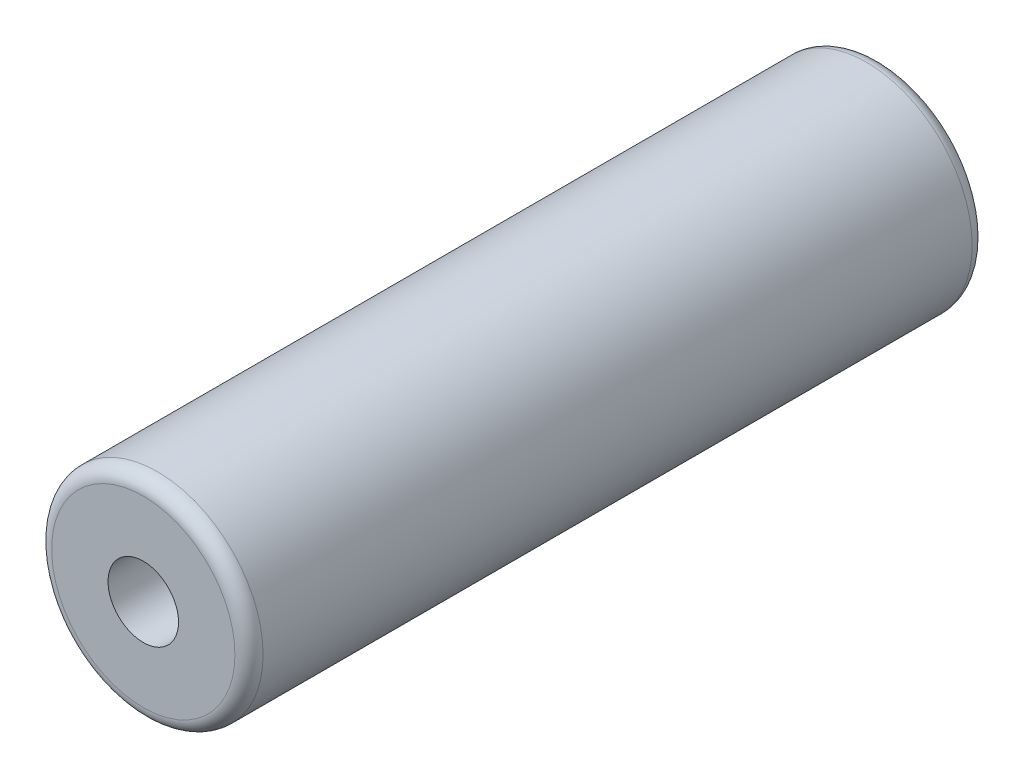
ISO-10303-21;
HEADER;
FILE_DESCRIPTION(('STEP AP214'),'2;1');
FILE_NAME('part.step','',(''),(''),'','','');
FILE_SCHEMA(('AUTOMOTIVE_DESIGN { 1 0 10303 214 1 1 1 1 }'));
ENDSEC;
DATA;
#1=APPLICATION_CONTEXT('core data for automotive mechanical design processes');
#2=APPLICATION_PROTOCOL_DEFINITION('international standard','automotive_design',2000,#1);
#3=PRODUCT_CONTEXT('',#1,'mechanical');
#4=PRODUCT('Part','Part','',(#3));
#5=PRODUCT_RELATED_PRODUCT_CATEGORY('part','',(#4));
#6=PRODUCT_DEFINITION_FORMATION('','',#4);
#7=PRODUCT_DEFINITION_CONTEXT('part definition',#1,'design');
#8=PRODUCT_DEFINITION('design','',#6,#7);
#9=PRODUCT_DEFINITION_SHAPE('','',#8);
#10=(LENGTH_UNIT() NAMED_UNIT(*) SI_UNIT(.MILLI.,.METRE.));
#11=(NAMED_UNIT(*) PLANE_ANGLE_UNIT() SI_UNIT($,.RADIAN.));
#12=(NAMED_UNIT(*) SI_UNIT($,.STERADIAN.) SOLID_ANGLE_UNIT());
#13=UNCERTAINTY_MEASURE_WITH_UNIT(LENGTH_MEASURE(1.E-05),#10,'distance_accuracy_value','');
#14=(GEOMETRIC_REPRESENTATION_CONTEXT(3) GLOBAL_UNCERTAINTY_ASSIGNED_CONTEXT((#13)) GLOBAL_UNIT_ASSIGNED_CONTEXT((#10,
#11,#12)) REPRESENTATION_CONTEXT('',''));
#15=CARTESIAN_POINT('',(0.,0.,0.));
#16=DIRECTION('',(0.,0.,1.));
#17=DIRECTION('',(1.,0.,0.));
#18=AXIS2_PLACEMENT_3D('',#15,#16,#17);
#19=CARTESIAN_POINT('',(0.,0.,26.15));
#20=DIRECTION('',(0.,0.,-1.));
#21=DIRECTION('',(-1.,0.,0.));
#22=AXIS2_PLACEMENT_3D('',#19,#20,#21);
#23=CYLINDRICAL_SURFACE('',#22,7.5);
#24=CARTESIAN_POINT('',(0.,0.,-25.15));
#25=DIRECTION('',(0.,0.,1.));
#26=DIRECTION('',(1.,0.,0.));
#27=AXIS2_PLACEMENT_3D('',#24,#25,#26);
#28=CIRCLE('',#27,7.5);
#29=CARTESIAN_POINT('',(7.5,0.,-25.15));
#30=VERTEX_POINT('',#29);
#31=EDGE_CURVE('E78',#30,#30,#28,.T.);
#32=ORIENTED_EDGE('',*,*,#31,.T.);
#33=EDGE_LOOP('',(#32));
#34=FACE_BOUND('',#33,.T.);
#35=CARTESIAN_POINT('',(0.,0.,25.15));
#36=DIRECTION('',(0.,0.,1.));
#37=DIRECTION('',(1.,0.,0.));
#38=AXIS2_PLACEMENT_3D('',#35,#36,#37);
#39=CIRCLE('',#38,7.5);
#40=CARTESIAN_POINT('',(7.5,0.,25.15));
#41=VERTEX_POINT('',#40);
#42=EDGE_CURVE('E75',#41,#41,#39,.F.);
#43=ORIENTED_EDGE('',*,*,#42,.T.);
#44=EDGE_LOOP('',(#43));
#45=FACE_BOUND('',#44,.T.);
#46=ADVANCED_FACE('F41',(#34,#45),#23,.T.);
#47=CARTESIAN_POINT('',(0.,0.,26.15));
#48=DIRECTION('',(0.,0.,1.));
#49=DIRECTION('',(1.,0.,0.));
#50=AXIS2_PLACEMENT_3D('',#47,#48,#49);
#51=PLANE('',#50);
#52=CARTESIAN_POINT('',(0.,0.,26.15));
#53=DIRECTION('',(0.,0.,1.));
#54=DIRECTION('',(1.,0.,0.));
#55=AXIS2_PLACEMENT_3D('',#52,#53,#54);
#56=CIRCLE('',#55,6.5);
#57=CARTESIAN_POINT('',(6.5,0.,26.15));
#58=VERTEX_POINT('',#57);
#59=EDGE_CURVE('E11',#58,#58,#56,.T.);
#60=ORIENTED_EDGE('',*,*,#59,.T.);
#61=EDGE_LOOP('',(#60));
#62=FACE_BOUND('',#61,.T.);
#63=CARTESIAN_POINT('',(0.,0.,26.15));
#64=DIRECTION('',(0.,0.,1.));
#65=DIRECTION('',(1.,0.,0.));
#66=AXIS2_PLACEMENT_3D('',#63,#64,#65);
#67=CIRCLE('',#66,2.5);
#68=CARTESIAN_POINT('',(2.5,0.,26.15));
#69=VERTEX_POINT('',#68);
#70=EDGE_CURVE('E64',#69,#69,#67,.T.);
#71=ORIENTED_EDGE('',*,*,#70,.F.);
#72=EDGE_LOOP('',(#71));
#73=FACE_BOUND('',#72,.T.);
#74=ADVANCED_FACE('F93',(#62,#73),#51,.T.);
#75=CARTESIAN_POINT('',(0.,0.,-26.15));
#76=DIRECTION('',(0.,0.,1.));
#77=DIRECTION('',(1.,0.,0.));
#78=AXIS2_PLACEMENT_3D('',#75,#76,#77);
#79=PLANE('',#78);
#80=CARTESIAN_POINT('',(0.,0.,-26.15));
#81=DIRECTION('',(0.,0.,-1.));
#82=DIRECTION('',(-1.,0.,0.));
#83=AXIS2_PLACEMENT_3D('',#80,#81,#82);
#84=CIRCLE('',#83,2.5);
#85=CARTESIAN_POINT('',(-2.5,0.,-26.15));
#86=VERTEX_POINT('',#85);
#87=EDGE_CURVE('E65',#86,#86,#84,.T.);
#88=ORIENTED_EDGE('',*,*,#87,.F.);
#89=EDGE_LOOP('',(#88));
#90=FACE_BOUND('',#89,.T.);
#91=CARTESIAN_POINT('',(0.,0.,-26.15));
#92=DIRECTION('',(0.,0.,1.));
#93=DIRECTION('',(1.,0.,0.));
#94=AXIS2_PLACEMENT_3D('',#91,#92,#93);
#95=CIRCLE('',#94,6.5);
#96=CARTESIAN_POINT('',(6.5,0.,-26.15));
#97=VERTEX_POINT('',#96);
#98=EDGE_CURVE('E49',#97,#97,#95,.F.);
#99=ORIENTED_EDGE('',*,*,#98,.T.);
#100=EDGE_LOOP('',(#99));
#101=FACE_BOUND('',#100,.T.);
#102=ADVANCED_FACE('F83',(#90,#101),#79,.F.);
#103=CARTESIAN_POINT('',(0.,0.,9.15));
#104=DIRECTION('',(0.,0.,1.));
#105=DIRECTION('',(1.,0.,0.));
#106=AXIS2_PLACEMENT_3D('',#103,#104,#105);
#107=CONICAL_SURFACE('',#106,2.5,1.02974425867665);
#108=CARTESIAN_POINT('',(0.,0.,7.6478484524311));
#109=VERTEX_POINT('',#108);
#110=VERTEX_LOOP('',#109);
#111=FACE_BOUND('',#110,.T.);
#112=CARTESIAN_POINT('',(0.,0.,9.15));
#113=DIRECTION('',(0.,0.,1.));
#114=DIRECTION('',(1.,0.,0.));
#115=AXIS2_PLACEMENT_3D('',#112,#113,#114);
#116=CIRCLE('',#115,2.5);
#117=CARTESIAN_POINT('',(2.5,0.,9.15));
#118=VERTEX_POINT('',#117);
#119=EDGE_CURVE('E68',#118,#118,#116,.T.);
#120=ORIENTED_EDGE('',*,*,#119,.T.);
#121=EDGE_LOOP('',(#120));
#122=FACE_BOUND('',#121,.T.);
#123=ADVANCED_FACE('F107',(#111,#122),#107,.F.);
#124=CARTESIAN_POINT('',(0.,0.,26.15));
#125=DIRECTION('',(0.,0.,1.));
#126=DIRECTION('',(1.,0.,0.));
#127=AXIS2_PLACEMENT_3D('',#124,#125,#126);
#128=CYLINDRICAL_SURFACE('',#127,2.5);
#129=ORIENTED_EDGE('',*,*,#119,.F.);
#130=EDGE_LOOP('',(#129));
#131=FACE_BOUND('',#130,.T.);
#132=ORIENTED_EDGE('',*,*,#70,.T.);
#133=EDGE_LOOP('',(#132));
#134=FACE_BOUND('',#133,.T.);
#135=ADVANCED_FACE('F88',(#131,#134),#128,.F.);
#136=CARTESIAN_POINT('',(0.,0.,-25.15));
#137=DIRECTION('',(0.,0.,1.));
#138=DIRECTION('',(1.,0.,0.));
#139=AXIS2_PLACEMENT_3D('',#136,#137,#138);
#140=TOROIDAL_SURFACE('',#139,6.5,1.);
#141=ORIENTED_EDGE('',*,*,#98,.F.);
#142=EDGE_LOOP('',(#141));
#143=FACE_BOUND('',#142,.T.);
#144=ORIENTED_EDGE('',*,*,#31,.F.);
#145=EDGE_LOOP('',(#144));
#146=FACE_BOUND('',#145,.T.);
#147=ADVANCED_FACE('F85',(#143,#146),#140,.T.);
#148=CARTESIAN_POINT('',(0.,0.,25.15));
#149=DIRECTION('',(0.,0.,1.));
#150=DIRECTION('',(1.,0.,0.));
#151=AXIS2_PLACEMENT_3D('',#148,#149,#150);
#152=TOROIDAL_SURFACE('',#151,6.5,1.);
#153=ORIENTED_EDGE('',*,*,#42,.F.);
#154=EDGE_LOOP('',(#153));
#155=FACE_BOUND('',#154,.T.);
#156=ORIENTED_EDGE('',*,*,#59,.F.);
#157=EDGE_LOOP('',(#156));
#158=FACE_BOUND('',#157,.T.);
#159=ADVANCED_FACE('F43',(#155,#158),#152,.T.);
#160=CARTESIAN_POINT('',(0.,0.,-9.15));
#161=DIRECTION('',(0.,0.,-1.));
#162=DIRECTION('',(-1.,0.,0.));
#163=AXIS2_PLACEMENT_3D('',#160,#161,#162);
#164=CONICAL_SURFACE('',#163,2.5,1.02974425867665);
#165=CARTESIAN_POINT('',(0.,0.,-7.6478484524311));
#166=VERTEX_POINT('',#165);
#167=VERTEX_LOOP('',#166);
#168=FACE_BOUND('',#167,.T.);
#169=CARTESIAN_POINT('',(0.,0.,-9.15));
#170=DIRECTION('',(0.,0.,-1.));
#171=DIRECTION('',(-1.,0.,0.));
#172=AXIS2_PLACEMENT_3D('',#169,#170,#171);
#173=CIRCLE('',#172,2.5);
#174=CARTESIAN_POINT('',(-2.5,0.,-9.15));
#175=VERTEX_POINT('',#174);
#176=EDGE_CURVE('E62',#175,#175,#173,.T.);
#177=ORIENTED_EDGE('',*,*,#176,.T.);
#178=EDGE_LOOP('',(#177));
#179=FACE_BOUND('',#178,.T.);
#180=ADVANCED_FACE('F55',(#168,#179),#164,.F.);
#181=CARTESIAN_POINT('',(0.,0.,-26.15));
#182=DIRECTION('',(0.,0.,-1.));
#183=DIRECTION('',(-1.,0.,0.));
#184=AXIS2_PLACEMENT_3D('',#181,#182,#183);
#185=CYLINDRICAL_SURFACE('',#184,2.5);
#186=ORIENTED_EDGE('',*,*,#176,.F.);
#187=EDGE_LOOP('',(#186));
#188=FACE_BOUND('',#187,.T.);
#189=ORIENTED_EDGE('',*,*,#87,.T.);
#190=EDGE_LOOP('',(#189));
#191=FACE_BOUND('',#190,.T.);
#192=ADVANCED_FACE('F58',(#188,#191),#185,.F.);
#193=CLOSED_SHELL('',(#46,#74,#102,#123,#135,#147,#159,#180,#192));
#194=MANIFOLD_SOLID_BREP('B2',#193);
#195=ADVANCED_BREP_SHAPE_REPRESENTATION('',(#18,#194),#14);
#196=SHAPE_DEFINITION_REPRESENTATION(#9,#195);
ENDSEC;
END-ISO-10303-21;
